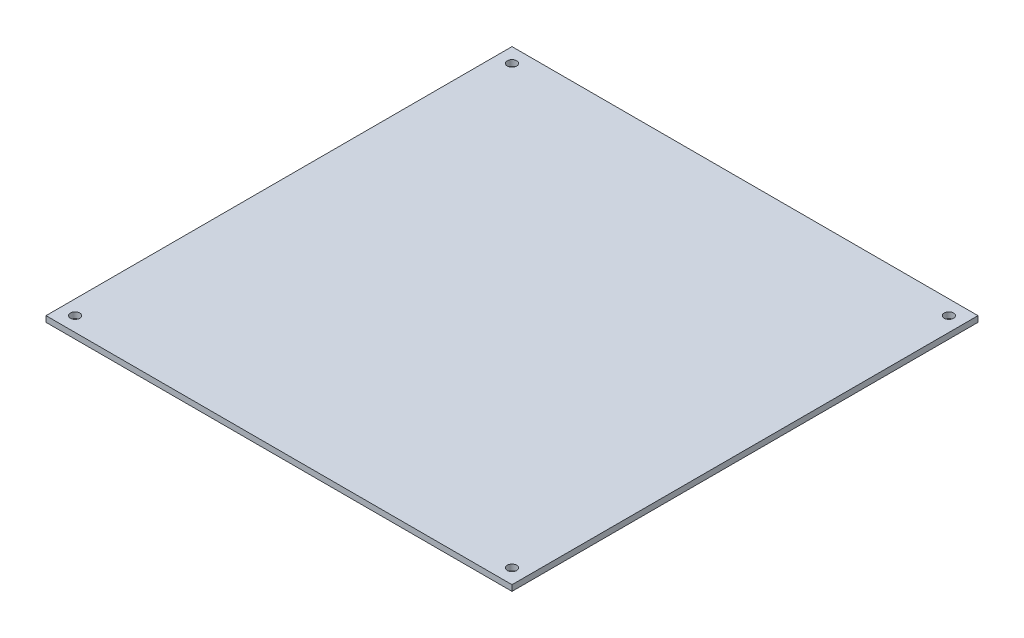
ISO-10303-21;
HEADER;
FILE_DESCRIPTION(('STEP AP214'),'2;1');
FILE_NAME('part.step','',(''),(''),'','','');
FILE_SCHEMA(('AUTOMOTIVE_DESIGN { 1 0 10303 214 1 1 1 1 }'));
ENDSEC;
DATA;
#1=APPLICATION_CONTEXT('core data for automotive mechanical design processes');
#2=APPLICATION_PROTOCOL_DEFINITION('international standard','automotive_design',2000,#1);
#3=PRODUCT_CONTEXT('',#1,'mechanical');
#4=PRODUCT('Part','Part','',(#3));
#5=PRODUCT_RELATED_PRODUCT_CATEGORY('part','',(#4));
#6=PRODUCT_DEFINITION_FORMATION('','',#4);
#7=PRODUCT_DEFINITION_CONTEXT('part definition',#1,'design');
#8=PRODUCT_DEFINITION('design','',#6,#7);
#9=PRODUCT_DEFINITION_SHAPE('','',#8);
#10=(LENGTH_UNIT() NAMED_UNIT(*) SI_UNIT(.MILLI.,.METRE.));
#11=(NAMED_UNIT(*) PLANE_ANGLE_UNIT() SI_UNIT($,.RADIAN.));
#12=(NAMED_UNIT(*) SI_UNIT($,.STERADIAN.) SOLID_ANGLE_UNIT());
#13=UNCERTAINTY_MEASURE_WITH_UNIT(LENGTH_MEASURE(1.E-05),#10,'distance_accuracy_value','');
#14=(GEOMETRIC_REPRESENTATION_CONTEXT(3) GLOBAL_UNCERTAINTY_ASSIGNED_CONTEXT((#13)) GLOBAL_UNIT_ASSIGNED_CONTEXT((#10,
#11,#12)) REPRESENTATION_CONTEXT('',''));
#15=CARTESIAN_POINT('',(0.,0.,0.));
#16=DIRECTION('',(0.,0.,1.));
#17=DIRECTION('',(1.,0.,0.));
#18=AXIS2_PLACEMENT_3D('',#15,#16,#17);
#19=CARTESIAN_POINT('',(200.,5.,200.));
#20=DIRECTION('',(-1.,0.,0.));
#21=DIRECTION('',(0.,0.,1.));
#22=AXIS2_PLACEMENT_3D('',#19,#20,#21);
#23=PLANE('',#22);
#24=DIRECTION('',(0.,0.,-1.));
#25=VECTOR('',#24,1.);
#26=CARTESIAN_POINT('',(200.,0.,200.));
#27=LINE('',#26,#25);
#28=CARTESIAN_POINT('',(200.,0.,200.));
#29=VERTEX_POINT('',#28);
#30=CARTESIAN_POINT('',(200.,0.,-200.));
#31=VERTEX_POINT('',#30);
#32=EDGE_CURVE('E98',#29,#31,#27,.T.);
#33=ORIENTED_EDGE('',*,*,#32,.T.);
#34=DIRECTION('',(0.,-1.,0.));
#35=VECTOR('',#34,1.);
#36=CARTESIAN_POINT('',(200.,5.,-200.));
#37=LINE('',#36,#35);
#38=CARTESIAN_POINT('',(200.,5.,-200.));
#39=VERTEX_POINT('',#38);
#40=EDGE_CURVE('E11',#39,#31,#37,.T.);
#41=ORIENTED_EDGE('',*,*,#40,.F.);
#42=DIRECTION('',(0.,0.,-1.));
#43=VECTOR('',#42,1.);
#44=CARTESIAN_POINT('',(200.,5.,200.));
#45=LINE('',#44,#43);
#46=CARTESIAN_POINT('',(200.,5.,200.));
#47=VERTEX_POINT('',#46);
#48=EDGE_CURVE('E86',#47,#39,#45,.T.);
#49=ORIENTED_EDGE('',*,*,#48,.F.);
#50=DIRECTION('',(0.,-1.,0.));
#51=VECTOR('',#50,1.);
#52=CARTESIAN_POINT('',(200.,5.,200.));
#53=LINE('',#52,#51);
#54=EDGE_CURVE('E94',#47,#29,#53,.T.);
#55=ORIENTED_EDGE('',*,*,#54,.T.);
#56=EDGE_LOOP('',(#33,#41,#49,#55));
#57=FACE_BOUND('',#56,.T.);
#58=ADVANCED_FACE('F35',(#57),#23,.F.);
#59=CARTESIAN_POINT('',(-200.,5.,-200.));
#60=DIRECTION('',(0.,0.,1.));
#61=DIRECTION('',(1.,0.,0.));
#62=AXIS2_PLACEMENT_3D('',#59,#60,#61);
#63=PLANE('',#62);
#64=DIRECTION('',(-1.,0.,0.));
#65=VECTOR('',#64,1.);
#66=CARTESIAN_POINT('',(-200.,0.,-200.));
#67=LINE('',#66,#65);
#68=CARTESIAN_POINT('',(-200.,0.,-200.));
#69=VERTEX_POINT('',#68);
#70=EDGE_CURVE('E90',#31,#69,#67,.T.);
#71=ORIENTED_EDGE('',*,*,#70,.T.);
#72=DIRECTION('',(0.,-1.,0.));
#73=VECTOR('',#72,1.);
#74=CARTESIAN_POINT('',(-200.,5.,-200.));
#75=LINE('',#74,#73);
#76=CARTESIAN_POINT('',(-200.,5.,-200.));
#77=VERTEX_POINT('',#76);
#78=EDGE_CURVE('E43',#77,#69,#75,.T.);
#79=ORIENTED_EDGE('',*,*,#78,.F.);
#80=DIRECTION('',(-1.,0.,0.));
#81=VECTOR('',#80,1.);
#82=CARTESIAN_POINT('',(-200.,5.,-200.));
#83=LINE('',#82,#81);
#84=EDGE_CURVE('E81',#39,#77,#83,.T.);
#85=ORIENTED_EDGE('',*,*,#84,.F.);
#86=ORIENTED_EDGE('',*,*,#40,.T.);
#87=EDGE_LOOP('',(#71,#79,#85,#86));
#88=FACE_BOUND('',#87,.T.);
#89=ADVANCED_FACE('F89',(#88),#63,.F.);
#90=CARTESIAN_POINT('',(-200.,5.,200.));
#91=DIRECTION('',(1.,0.,0.));
#92=DIRECTION('',(0.,0.,-1.));
#93=AXIS2_PLACEMENT_3D('',#90,#91,#92);
#94=PLANE('',#93);
#95=DIRECTION('',(0.,0.,1.));
#96=VECTOR('',#95,1.);
#97=CARTESIAN_POINT('',(-200.,0.,200.));
#98=LINE('',#97,#96);
#99=CARTESIAN_POINT('',(-200.,0.,200.));
#100=VERTEX_POINT('',#99);
#101=EDGE_CURVE('E68',#69,#100,#98,.T.);
#102=ORIENTED_EDGE('',*,*,#101,.T.);
#103=DIRECTION('',(0.,-1.,0.));
#104=VECTOR('',#103,1.);
#105=CARTESIAN_POINT('',(-200.,5.,200.));
#106=LINE('',#105,#104);
#107=CARTESIAN_POINT('',(-200.,5.,200.));
#108=VERTEX_POINT('',#107);
#109=EDGE_CURVE('E91',#108,#100,#106,.T.);
#110=ORIENTED_EDGE('',*,*,#109,.F.);
#111=DIRECTION('',(0.,0.,1.));
#112=VECTOR('',#111,1.);
#113=CARTESIAN_POINT('',(-200.,5.,200.));
#114=LINE('',#113,#112);
#115=EDGE_CURVE('E84',#77,#108,#114,.T.);
#116=ORIENTED_EDGE('',*,*,#115,.F.);
#117=ORIENTED_EDGE('',*,*,#78,.T.);
#118=EDGE_LOOP('',(#102,#110,#116,#117));
#119=FACE_BOUND('',#118,.T.);
#120=ADVANCED_FACE('F92',(#119),#94,.F.);
#121=CARTESIAN_POINT('',(-200.,5.,200.));
#122=DIRECTION('',(0.,0.,-1.));
#123=DIRECTION('',(-1.,0.,0.));
#124=AXIS2_PLACEMENT_3D('',#121,#122,#123);
#125=PLANE('',#124);
#126=DIRECTION('',(1.,0.,0.));
#127=VECTOR('',#126,1.);
#128=CARTESIAN_POINT('',(-200.,0.,200.));
#129=LINE('',#128,#127);
#130=EDGE_CURVE('E74',#100,#29,#129,.T.);
#131=ORIENTED_EDGE('',*,*,#130,.T.);
#132=ORIENTED_EDGE('',*,*,#54,.F.);
#133=DIRECTION('',(1.,0.,0.));
#134=VECTOR('',#133,1.);
#135=CARTESIAN_POINT('',(-200.,5.,200.));
#136=LINE('',#135,#134);
#137=EDGE_CURVE('E51',#108,#47,#136,.T.);
#138=ORIENTED_EDGE('',*,*,#137,.F.);
#139=ORIENTED_EDGE('',*,*,#109,.T.);
#140=EDGE_LOOP('',(#131,#132,#138,#139));
#141=FACE_BOUND('',#140,.T.);
#142=ADVANCED_FACE('F106',(#141),#125,.F.);
#143=CARTESIAN_POINT('',(0.,5.,0.));
#144=DIRECTION('',(0.,-1.,0.));
#145=DIRECTION('',(0.,0.,-1.));
#146=AXIS2_PLACEMENT_3D('',#143,#144,#145);
#147=PLANE('',#146);
#148=CARTESIAN_POINT('',(187.5,5.,-187.5));
#149=DIRECTION('',(0.,1.,0.));
#150=DIRECTION('',(0.,0.,-1.));
#151=AXIS2_PLACEMENT_3D('',#148,#149,#150);
#152=CIRCLE('',#151,3.99999999999999);
#153=CARTESIAN_POINT('',(187.5,5.,-191.5));
#154=VERTEX_POINT('',#153);
#155=EDGE_CURVE('E125',#154,#154,#152,.T.);
#156=ORIENTED_EDGE('',*,*,#155,.F.);
#157=EDGE_LOOP('',(#156));
#158=FACE_BOUND('',#157,.T.);
#159=CARTESIAN_POINT('',(-187.5,5.,187.5));
#160=DIRECTION('',(0.,1.,0.));
#161=DIRECTION('',(0.,0.,-1.));
#162=AXIS2_PLACEMENT_3D('',#159,#160,#161);
#163=CIRCLE('',#162,3.99999999999999);
#164=CARTESIAN_POINT('',(-187.5,5.,183.5));
#165=VERTEX_POINT('',#164);
#166=EDGE_CURVE('E118',#165,#165,#163,.T.);
#167=ORIENTED_EDGE('',*,*,#166,.F.);
#168=EDGE_LOOP('',(#167));
#169=FACE_BOUND('',#168,.T.);
#170=CARTESIAN_POINT('',(187.5,5.,187.5));
#171=DIRECTION('',(0.,1.,0.));
#172=DIRECTION('',(0.,0.,1.));
#173=AXIS2_PLACEMENT_3D('',#170,#171,#172);
#174=CIRCLE('',#173,3.99999999999999);
#175=CARTESIAN_POINT('',(187.5,5.,191.5));
#176=VERTEX_POINT('',#175);
#177=EDGE_CURVE('E130',#176,#176,#174,.T.);
#178=ORIENTED_EDGE('',*,*,#177,.F.);
#179=EDGE_LOOP('',(#178));
#180=FACE_BOUND('',#179,.T.);
#181=CARTESIAN_POINT('',(-187.5,5.,-187.5));
#182=DIRECTION('',(0.,1.,0.));
#183=DIRECTION('',(0.,0.,1.));
#184=AXIS2_PLACEMENT_3D('',#181,#182,#183);
#185=CIRCLE('',#184,3.99999999999999);
#186=CARTESIAN_POINT('',(-187.5,5.,-183.5));
#187=VERTEX_POINT('',#186);
#188=EDGE_CURVE('E112',#187,#187,#185,.T.);
#189=ORIENTED_EDGE('',*,*,#188,.F.);
#190=EDGE_LOOP('',(#189));
#191=FACE_BOUND('',#190,.T.);
#192=ORIENTED_EDGE('',*,*,#48,.T.);
#193=ORIENTED_EDGE('',*,*,#84,.T.);
#194=ORIENTED_EDGE('',*,*,#115,.T.);
#195=ORIENTED_EDGE('',*,*,#137,.T.);
#196=EDGE_LOOP('',(#192,#193,#194,#195));
#197=FACE_BOUND('',#196,.T.);
#198=ADVANCED_FACE('F82',(#158,#169,#180,#191,#197),#147,.F.);
#199=CARTESIAN_POINT('',(0.,0.,0.));
#200=DIRECTION('',(0.,-1.,0.));
#201=DIRECTION('',(0.,0.,-1.));
#202=AXIS2_PLACEMENT_3D('',#199,#200,#201);
#203=PLANE('',#202);
#204=CARTESIAN_POINT('',(187.5,0.,-187.5));
#205=DIRECTION('',(0.,1.,0.));
#206=DIRECTION('',(0.,0.,-1.));
#207=AXIS2_PLACEMENT_3D('',#204,#205,#206);
#208=CIRCLE('',#207,3.99999999999999);
#209=CARTESIAN_POINT('',(187.5,0.,-191.5));
#210=VERTEX_POINT('',#209);
#211=EDGE_CURVE('E115',#210,#210,#208,.T.);
#212=ORIENTED_EDGE('',*,*,#211,.T.);
#213=EDGE_LOOP('',(#212));
#214=FACE_BOUND('',#213,.T.);
#215=CARTESIAN_POINT('',(-187.5,0.,187.5));
#216=DIRECTION('',(0.,1.,0.));
#217=DIRECTION('',(0.,0.,-1.));
#218=AXIS2_PLACEMENT_3D('',#215,#216,#217);
#219=CIRCLE('',#218,3.99999999999999);
#220=CARTESIAN_POINT('',(-187.5,0.,183.5));
#221=VERTEX_POINT('',#220);
#222=EDGE_CURVE('E121',#221,#221,#219,.T.);
#223=ORIENTED_EDGE('',*,*,#222,.T.);
#224=EDGE_LOOP('',(#223));
#225=FACE_BOUND('',#224,.T.);
#226=CARTESIAN_POINT('',(187.5,0.,187.5));
#227=DIRECTION('',(0.,1.,0.));
#228=DIRECTION('',(0.,0.,1.));
#229=AXIS2_PLACEMENT_3D('',#226,#227,#228);
#230=CIRCLE('',#229,3.99999999999999);
#231=CARTESIAN_POINT('',(187.5,0.,191.5));
#232=VERTEX_POINT('',#231);
#233=EDGE_CURVE('E122',#232,#232,#230,.T.);
#234=ORIENTED_EDGE('',*,*,#233,.T.);
#235=EDGE_LOOP('',(#234));
#236=FACE_BOUND('',#235,.T.);
#237=CARTESIAN_POINT('',(-187.5,0.,-187.5));
#238=DIRECTION('',(0.,1.,0.));
#239=DIRECTION('',(0.,0.,1.));
#240=AXIS2_PLACEMENT_3D('',#237,#238,#239);
#241=CIRCLE('',#240,3.99999999999999);
#242=CARTESIAN_POINT('',(-187.5,0.,-183.5));
#243=VERTEX_POINT('',#242);
#244=EDGE_CURVE('E101',#243,#243,#241,.T.);
#245=ORIENTED_EDGE('',*,*,#244,.T.);
#246=EDGE_LOOP('',(#245));
#247=FACE_BOUND('',#246,.T.);
#248=ORIENTED_EDGE('',*,*,#32,.F.);
#249=ORIENTED_EDGE('',*,*,#130,.F.);
#250=ORIENTED_EDGE('',*,*,#101,.F.);
#251=ORIENTED_EDGE('',*,*,#70,.F.);
#252=EDGE_LOOP('',(#248,#249,#250,#251));
#253=FACE_BOUND('',#252,.T.);
#254=ADVANCED_FACE('F109',(#214,#225,#236,#247,#253),#203,.T.);
#255=CARTESIAN_POINT('',(-187.5,0.,-187.5));
#256=DIRECTION('',(0.,1.,0.));
#257=DIRECTION('',(0.,0.,1.));
#258=AXIS2_PLACEMENT_3D('',#255,#256,#257);
#259=CYLINDRICAL_SURFACE('',#258,3.99999999999999);
#260=ORIENTED_EDGE('',*,*,#244,.F.);
#261=EDGE_LOOP('',(#260));
#262=FACE_BOUND('',#261,.T.);
#263=ORIENTED_EDGE('',*,*,#188,.T.);
#264=EDGE_LOOP('',(#263));
#265=FACE_BOUND('',#264,.T.);
#266=ADVANCED_FACE('F142',(#262,#265),#259,.F.);
#267=CARTESIAN_POINT('',(187.5,0.,187.5));
#268=DIRECTION('',(0.,1.,0.));
#269=DIRECTION('',(0.,0.,1.));
#270=AXIS2_PLACEMENT_3D('',#267,#268,#269);
#271=CYLINDRICAL_SURFACE('',#270,3.99999999999999);
#272=ORIENTED_EDGE('',*,*,#233,.F.);
#273=EDGE_LOOP('',(#272));
#274=FACE_BOUND('',#273,.T.);
#275=ORIENTED_EDGE('',*,*,#177,.T.);
#276=EDGE_LOOP('',(#275));
#277=FACE_BOUND('',#276,.T.);
#278=ADVANCED_FACE('F138',(#274,#277),#271,.F.);
#279=CARTESIAN_POINT('',(-187.5,0.,187.5));
#280=DIRECTION('',(0.,1.,0.));
#281=DIRECTION('',(0.,0.,1.));
#282=AXIS2_PLACEMENT_3D('',#279,#280,#281);
#283=CYLINDRICAL_SURFACE('',#282,3.99999999999999);
#284=ORIENTED_EDGE('',*,*,#222,.F.);
#285=EDGE_LOOP('',(#284));
#286=FACE_BOUND('',#285,.T.);
#287=ORIENTED_EDGE('',*,*,#166,.T.);
#288=EDGE_LOOP('',(#287));
#289=FACE_BOUND('',#288,.T.);
#290=ADVANCED_FACE('F141',(#286,#289),#283,.F.);
#291=CARTESIAN_POINT('',(187.5,0.,-187.5));
#292=DIRECTION('',(0.,1.,0.));
#293=DIRECTION('',(0.,0.,1.));
#294=AXIS2_PLACEMENT_3D('',#291,#292,#293);
#295=CYLINDRICAL_SURFACE('',#294,3.99999999999999);
#296=ORIENTED_EDGE('',*,*,#211,.F.);
#297=EDGE_LOOP('',(#296));
#298=FACE_BOUND('',#297,.T.);
#299=ORIENTED_EDGE('',*,*,#155,.T.);
#300=EDGE_LOOP('',(#299));
#301=FACE_BOUND('',#300,.T.);
#302=ADVANCED_FACE('F203',(#298,#301),#295,.F.);
#303=CLOSED_SHELL('',(#58,#89,#120,#142,#198,#254,#266,#278,#290,#302));
#304=MANIFOLD_SOLID_BREP('B2',#303);
#305=ADVANCED_BREP_SHAPE_REPRESENTATION('',(#18,#304),#14);
#306=SHAPE_DEFINITION_REPRESENTATION(#9,#305);
ENDSEC;
END-ISO-10303-21;
